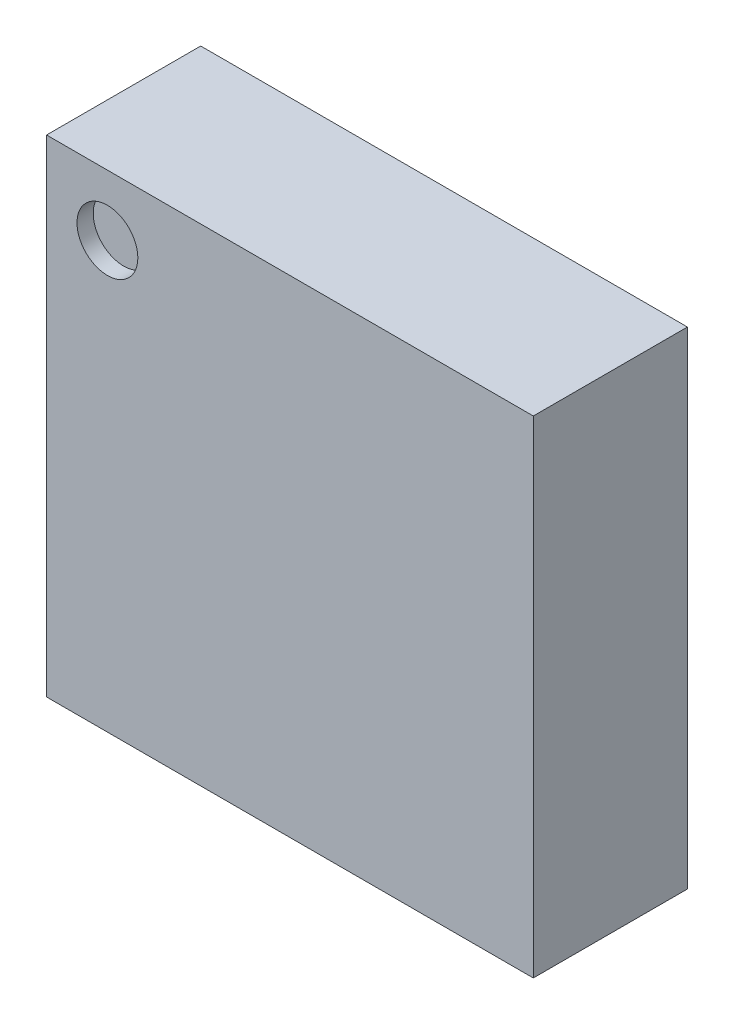
ISO-10303-21;
HEADER;
FILE_DESCRIPTION(('STEP AP214'),'2;1');
FILE_NAME('part.step','',(''),(''),'','','');
FILE_SCHEMA(('AUTOMOTIVE_DESIGN { 1 0 10303 214 1 1 1 1 }'));
ENDSEC;
DATA;
#1=APPLICATION_CONTEXT('core data for automotive mechanical design processes');
#2=APPLICATION_PROTOCOL_DEFINITION('international standard','automotive_design',2000,#1);
#3=PRODUCT_CONTEXT('',#1,'mechanical');
#4=PRODUCT('Part','Part','',(#3));
#5=PRODUCT_RELATED_PRODUCT_CATEGORY('part','',(#4));
#6=PRODUCT_DEFINITION_FORMATION('','',#4);
#7=PRODUCT_DEFINITION_CONTEXT('part definition',#1,'design');
#8=PRODUCT_DEFINITION('design','',#6,#7);
#9=PRODUCT_DEFINITION_SHAPE('','',#8);
#10=(LENGTH_UNIT() NAMED_UNIT(*) SI_UNIT(.MILLI.,.METRE.));
#11=(NAMED_UNIT(*) PLANE_ANGLE_UNIT() SI_UNIT($,.RADIAN.));
#12=(NAMED_UNIT(*) SI_UNIT($,.STERADIAN.) SOLID_ANGLE_UNIT());
#13=UNCERTAINTY_MEASURE_WITH_UNIT(LENGTH_MEASURE(1.E-05),#10,'distance_accuracy_value','');
#14=(GEOMETRIC_REPRESENTATION_CONTEXT(3) GLOBAL_UNCERTAINTY_ASSIGNED_CONTEXT((#13)) GLOBAL_UNIT_ASSIGNED_CONTEXT((#10,
#11,#12)) REPRESENTATION_CONTEXT('',''));
#15=CARTESIAN_POINT('',(0.,0.,0.));
#16=DIRECTION('',(0.,0.,1.));
#17=DIRECTION('',(1.,0.,0.));
#18=AXIS2_PLACEMENT_3D('',#15,#16,#17);
#19=CARTESIAN_POINT('',(-1.125,1.125,0.9));
#20=DIRECTION('',(0.,0.,1.));
#21=DIRECTION('',(1.,0.,0.));
#22=AXIS2_PLACEMENT_3D('',#19,#20,#21);
#23=PLANE('',#22);
#24=CARTESIAN_POINT('',(-1.125,1.125,0.9));
#25=DIRECTION('',(0.,0.,1.));
#26=DIRECTION('',(1.,0.,0.));
#27=AXIS2_PLACEMENT_3D('',#24,#25,#26);
#28=CIRCLE('',#27,0.1875);
#29=CARTESIAN_POINT('',(-0.9375,1.125,0.9));
#30=VERTEX_POINT('',#29);
#31=EDGE_CURVE('E20',#30,#30,#28,.T.);
#32=ORIENTED_EDGE('',*,*,#31,.T.);
#33=EDGE_LOOP('',(#32));
#34=FACE_BOUND('',#33,.T.);
#35=ADVANCED_FACE('F17',(#34),#23,.T.);
#36=CARTESIAN_POINT('',(-1.125,1.125,0.9));
#37=DIRECTION('',(0.,0.,1.));
#38=DIRECTION('',(1.,0.,0.));
#39=AXIS2_PLACEMENT_3D('',#36,#37,#38);
#40=CYLINDRICAL_SURFACE('',#39,0.1875);
#41=CARTESIAN_POINT('',(-1.125,1.125,1.));
#42=DIRECTION('',(0.,0.,1.));
#43=DIRECTION('',(1.,0.,0.));
#44=AXIS2_PLACEMENT_3D('',#41,#42,#43);
#45=CIRCLE('',#44,0.1875);
#46=CARTESIAN_POINT('',(-0.9375,1.125,1.));
#47=VERTEX_POINT('',#46);
#48=EDGE_CURVE('E66',#47,#47,#45,.F.);
#49=ORIENTED_EDGE('',*,*,#48,.F.);
#50=EDGE_LOOP('',(#49));
#51=FACE_BOUND('',#50,.T.);
#52=ORIENTED_EDGE('',*,*,#31,.F.);
#53=EDGE_LOOP('',(#52));
#54=FACE_BOUND('',#53,.T.);
#55=ADVANCED_FACE('F87',(#51,#54),#40,.F.);
#56=CARTESIAN_POINT('',(-1.5,-1.5,1.));
#57=DIRECTION('',(0.,0.,1.));
#58=DIRECTION('',(1.,0.,0.));
#59=AXIS2_PLACEMENT_3D('',#56,#57,#58);
#60=PLANE('',#59);
#61=ORIENTED_EDGE('',*,*,#48,.T.);
#62=EDGE_LOOP('',(#61));
#63=FACE_BOUND('',#62,.T.);
#64=DIRECTION('',(0.,1.,0.));
#65=VECTOR('',#64,1.);
#66=CARTESIAN_POINT('',(1.5,-1.5,1.));
#67=LINE('',#66,#65);
#68=CARTESIAN_POINT('',(1.5,1.5,1.));
#69=VERTEX_POINT('',#68);
#70=CARTESIAN_POINT('',(1.5,-1.5,1.));
#71=VERTEX_POINT('',#70);
#72=EDGE_CURVE('E166',#69,#71,#67,.F.);
#73=ORIENTED_EDGE('',*,*,#72,.F.);
#74=DIRECTION('',(1.,0.,0.));
#75=VECTOR('',#74,1.);
#76=CARTESIAN_POINT('',(-1.5,1.5,1.));
#77=LINE('',#76,#75);
#78=CARTESIAN_POINT('',(-1.5,1.5,1.));
#79=VERTEX_POINT('',#78);
#80=EDGE_CURVE('E60',#79,#69,#77,.T.);
#81=ORIENTED_EDGE('',*,*,#80,.F.);
#82=DIRECTION('',(0.,1.,0.));
#83=VECTOR('',#82,1.);
#84=CARTESIAN_POINT('',(-1.5,-1.5,1.));
#85=LINE('',#84,#83);
#86=CARTESIAN_POINT('',(-1.5,-1.5,1.));
#87=VERTEX_POINT('',#86);
#88=EDGE_CURVE('E58',#79,#87,#85,.F.);
#89=ORIENTED_EDGE('',*,*,#88,.T.);
#90=DIRECTION('',(1.,0.,0.));
#91=VECTOR('',#90,1.);
#92=CARTESIAN_POINT('',(-1.5,-1.5,1.));
#93=LINE('',#92,#91);
#94=EDGE_CURVE('E55',#87,#71,#93,.T.);
#95=ORIENTED_EDGE('',*,*,#94,.T.);
#96=EDGE_LOOP('',(#73,#81,#89,#95));
#97=FACE_BOUND('',#96,.T.);
#98=ADVANCED_FACE('F59',(#63,#97),#60,.T.);
#99=CARTESIAN_POINT('',(-1.5,-1.5,0.05));
#100=DIRECTION('',(1.,0.,0.));
#101=DIRECTION('',(0.,0.,-1.));
#102=AXIS2_PLACEMENT_3D('',#99,#100,#101);
#103=PLANE('',#102);
#104=DIRECTION('',(0.,0.,1.));
#105=VECTOR('',#104,1.);
#106=CARTESIAN_POINT('',(-1.5,1.5,0.05));
#107=LINE('',#106,#105);
#108=CARTESIAN_POINT('',(-1.5,1.5,0.05));
#109=VERTEX_POINT('',#108);
#110=EDGE_CURVE('E170',#109,#79,#107,.T.);
#111=ORIENTED_EDGE('',*,*,#110,.F.);
#112=DIRECTION('',(0.,1.,0.));
#113=VECTOR('',#112,1.);
#114=CARTESIAN_POINT('',(-1.5,-1.5,0.05));
#115=LINE('',#114,#113);
#116=CARTESIAN_POINT('',(-1.5,-1.5,0.05));
#117=VERTEX_POINT('',#116);
#118=EDGE_CURVE('E77',#109,#117,#115,.F.);
#119=ORIENTED_EDGE('',*,*,#118,.T.);
#120=DIRECTION('',(0.,0.,1.));
#121=VECTOR('',#120,1.);
#122=CARTESIAN_POINT('',(-1.5,-1.5,0.05));
#123=LINE('',#122,#121);
#124=EDGE_CURVE('E65',#117,#87,#123,.T.);
#125=ORIENTED_EDGE('',*,*,#124,.T.);
#126=ORIENTED_EDGE('',*,*,#88,.F.);
#127=EDGE_LOOP('',(#111,#119,#125,#126));
#128=FACE_BOUND('',#127,.T.);
#129=ADVANCED_FACE('F76',(#128),#103,.F.);
#130=CARTESIAN_POINT('',(-1.5,-1.5,0.05));
#131=DIRECTION('',(0.,1.,0.));
#132=DIRECTION('',(0.,0.,1.));
#133=AXIS2_PLACEMENT_3D('',#130,#131,#132);
#134=PLANE('',#133);
#135=ORIENTED_EDGE('',*,*,#94,.F.);
#136=ORIENTED_EDGE('',*,*,#124,.F.);
#137=DIRECTION('',(1.,0.,0.));
#138=VECTOR('',#137,1.);
#139=CARTESIAN_POINT('',(-1.5,-1.5,0.05));
#140=LINE('',#139,#138);
#141=CARTESIAN_POINT('',(1.5,-1.5,0.05));
#142=VERTEX_POINT('',#141);
#143=EDGE_CURVE('E168',#117,#142,#140,.T.);
#144=ORIENTED_EDGE('',*,*,#143,.T.);
#145=DIRECTION('',(0.,0.,-1.));
#146=VECTOR('',#145,1.);
#147=CARTESIAN_POINT('',(1.5,-1.5,0.05));
#148=LINE('',#147,#146);
#149=EDGE_CURVE('E73',#71,#142,#148,.T.);
#150=ORIENTED_EDGE('',*,*,#149,.F.);
#151=EDGE_LOOP('',(#135,#136,#144,#150));
#152=FACE_BOUND('',#151,.T.);
#153=ADVANCED_FACE('F70',(#152),#134,.F.);
#154=CARTESIAN_POINT('',(1.5,-1.5,0.05));
#155=DIRECTION('',(1.,0.,0.));
#156=DIRECTION('',(0.,0.,-1.));
#157=AXIS2_PLACEMENT_3D('',#154,#155,#156);
#158=PLANE('',#157);
#159=DIRECTION('',(0.,0.,1.));
#160=VECTOR('',#159,1.);
#161=CARTESIAN_POINT('',(1.5,1.5,0.05));
#162=LINE('',#161,#160);
#163=CARTESIAN_POINT('',(1.5,1.5,0.05));
#164=VERTEX_POINT('',#163);
#165=EDGE_CURVE('E34',#69,#164,#162,.F.);
#166=ORIENTED_EDGE('',*,*,#165,.F.);
#167=ORIENTED_EDGE('',*,*,#72,.T.);
#168=ORIENTED_EDGE('',*,*,#149,.T.);
#169=DIRECTION('',(0.,1.,0.));
#170=VECTOR('',#169,1.);
#171=CARTESIAN_POINT('',(1.5,-1.5,0.05));
#172=LINE('',#171,#170);
#173=EDGE_CURVE('E26',#142,#164,#172,.T.);
#174=ORIENTED_EDGE('',*,*,#173,.T.);
#175=EDGE_LOOP('',(#166,#167,#168,#174));
#176=FACE_BOUND('',#175,.T.);
#177=ADVANCED_FACE('F104',(#176),#158,.T.);
#178=CARTESIAN_POINT('',(-1.5,1.5,0.05));
#179=DIRECTION('',(0.,1.,0.));
#180=DIRECTION('',(0.,0.,1.));
#181=AXIS2_PLACEMENT_3D('',#178,#179,#180);
#182=PLANE('',#181);
#183=ORIENTED_EDGE('',*,*,#80,.T.);
#184=ORIENTED_EDGE('',*,*,#165,.T.);
#185=DIRECTION('',(1.,0.,0.));
#186=VECTOR('',#185,1.);
#187=CARTESIAN_POINT('',(-1.5,1.5,0.05));
#188=LINE('',#187,#186);
#189=EDGE_CURVE('E11',#164,#109,#188,.F.);
#190=ORIENTED_EDGE('',*,*,#189,.T.);
#191=ORIENTED_EDGE('',*,*,#110,.T.);
#192=EDGE_LOOP('',(#183,#184,#190,#191));
#193=FACE_BOUND('',#192,.T.);
#194=ADVANCED_FACE('F98',(#193),#182,.T.);
#195=CARTESIAN_POINT('',(-1.5,-1.5,0.05));
#196=DIRECTION('',(0.,0.,1.));
#197=DIRECTION('',(1.,0.,0.));
#198=AXIS2_PLACEMENT_3D('',#195,#196,#197);
#199=PLANE('',#198);
#200=ORIENTED_EDGE('',*,*,#173,.F.);
#201=ORIENTED_EDGE('',*,*,#143,.F.);
#202=ORIENTED_EDGE('',*,*,#118,.F.);
#203=ORIENTED_EDGE('',*,*,#189,.F.);
#204=EDGE_LOOP('',(#200,#201,#202,#203));
#205=FACE_BOUND('',#204,.T.);
#206=ADVANCED_FACE('F96',(#205),#199,.F.);
#207=CLOSED_SHELL('',(#35,#55,#98,#129,#153,#177,#194,#206));
#208=MANIFOLD_SOLID_BREP('B1',#207);
#209=ADVANCED_BREP_SHAPE_REPRESENTATION('',(#18,#208),#14);
#210=SHAPE_DEFINITION_REPRESENTATION(#9,#209);
ENDSEC;
END-ISO-10303-21;
